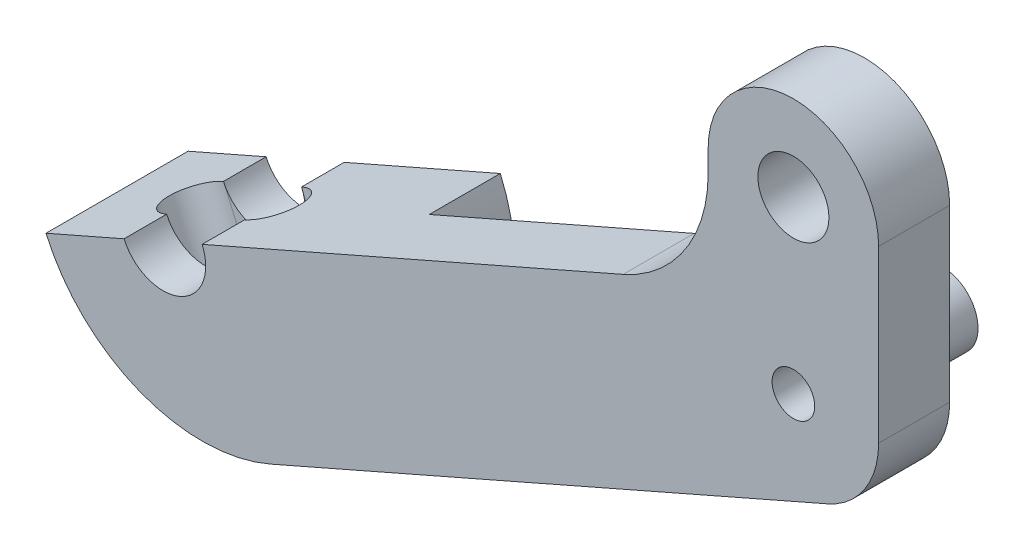
ISO-10303-21;
HEADER;
FILE_DESCRIPTION(('STEP AP214'),'2;1');
FILE_NAME('part.step','',(''),(''),'','','');
FILE_SCHEMA(('AUTOMOTIVE_DESIGN { 1 0 10303 214 1 1 1 1 }'));
ENDSEC;
DATA;
#1=APPLICATION_CONTEXT('core data for automotive mechanical design processes');
#2=APPLICATION_PROTOCOL_DEFINITION('international standard','automotive_design',2000,#1);
#3=PRODUCT_CONTEXT('',#1,'mechanical');
#4=PRODUCT('Part','Part','',(#3));
#5=PRODUCT_RELATED_PRODUCT_CATEGORY('part','',(#4));
#6=PRODUCT_DEFINITION_FORMATION('','',#4);
#7=PRODUCT_DEFINITION_CONTEXT('part definition',#1,'design');
#8=PRODUCT_DEFINITION('design','',#6,#7);
#9=PRODUCT_DEFINITION_SHAPE('','',#8);
#10=(LENGTH_UNIT() NAMED_UNIT(*) SI_UNIT(.MILLI.,.METRE.));
#11=(NAMED_UNIT(*) PLANE_ANGLE_UNIT() SI_UNIT($,.RADIAN.));
#12=(NAMED_UNIT(*) SI_UNIT($,.STERADIAN.) SOLID_ANGLE_UNIT());
#13=UNCERTAINTY_MEASURE_WITH_UNIT(LENGTH_MEASURE(1.E-05),#10,'distance_accuracy_value','');
#14=(GEOMETRIC_REPRESENTATION_CONTEXT(3) GLOBAL_UNCERTAINTY_ASSIGNED_CONTEXT((#13)) GLOBAL_UNIT_ASSIGNED_CONTEXT((#10,
#11,#12)) REPRESENTATION_CONTEXT('',''));
#15=CARTESIAN_POINT('',(0.,0.,0.));
#16=DIRECTION('',(0.,0.,1.));
#17=DIRECTION('',(1.,0.,0.));
#18=AXIS2_PLACEMENT_3D('',#15,#16,#17);
#19=CARTESIAN_POINT('',(0.,-12.,0.));
#20=DIRECTION('',(0.,0.,1.));
#21=DIRECTION('',(1.,0.,0.));
#22=AXIS2_PLACEMENT_3D('',#19,#20,#21);
#23=PLANE('',#22);
#24=DIRECTION('',(0.915917622148678,0.40136630331595,0.));
#25=VECTOR('',#24,1.);
#26=CARTESIAN_POINT('',(2.4081978198957,-17.4955057328921,0.));
#27=LINE('',#26,#25);
#28=CARTESIAN_POINT('',(-34.9786849430438,-33.8788949855906,0.));
#29=VERTEX_POINT('',#28);
#30=CARTESIAN_POINT('',(2.4081978198957,-17.4955057328921,0.));
#31=VERTEX_POINT('',#30);
#32=EDGE_CURVE('E283',#29,#31,#27,.T.);
#33=ORIENTED_EDGE('',*,*,#32,.F.);
#34=DIRECTION('',(0.40136630331595,-0.915917622148678,0.));
#35=VECTOR('',#34,1.);
#36=CARTESIAN_POINT('',(-41.400545796099,-19.2242130312118,0.));
#37=LINE('',#36,#35);
#38=CARTESIAN_POINT('',(-35.0460504375054,-33.7251669745634,0.));
#39=VERTEX_POINT('',#38);
#40=EDGE_CURVE('E55',#29,#39,#37,.F.);
#41=ORIENTED_EDGE('',*,*,#40,.T.);
#42=CARTESIAN_POINT('',(-41.6269158271326,-23.6906161264383,0.));
#43=DIRECTION('',(0.,0.,-1.));
#44=DIRECTION('',(-1.,0.,0.));
#45=AXIS2_PLACEMENT_3D('',#42,#43,#44);
#46=CIRCLE('',#45,12.);
#47=CARTESIAN_POINT('',(-30.6359043613484,-18.8742204866469,0.));
#48=VERTEX_POINT('',#47);
#49=EDGE_CURVE('E248',#48,#39,#46,.T.);
#50=ORIENTED_EDGE('',*,*,#49,.F.);
#51=DIRECTION('',(-0.915917622148678,-0.40136630331595,0.));
#52=VECTOR('',#51,1.);
#53=CARTESIAN_POINT('',(-41.6269158271326,-23.6906161264383,0.));
#54=LINE('',#53,#52);
#55=CARTESIAN_POINT('',(-11.9863369668405,-10.7017519779449,0.));
#56=VERTEX_POINT('',#55);
#57=EDGE_CURVE('E310',#56,#48,#54,.T.);
#58=ORIENTED_EDGE('',*,*,#57,.F.);
#59=CARTESIAN_POINT('',(-16.,-1.54257575645812,0.));
#60=DIRECTION('',(0.,0.,-1.));
#61=DIRECTION('',(-1.,0.,0.));
#62=AXIS2_PLACEMENT_3D('',#59,#60,#61);
#63=CIRCLE('',#62,10.);
#64=CARTESIAN_POINT('',(-5.99999999999999,-1.54257575645804,0.));
#65=VERTEX_POINT('',#64);
#66=EDGE_CURVE('E308',#65,#56,#63,.T.);
#67=ORIENTED_EDGE('',*,*,#66,.F.);
#68=DIRECTION('',(0.,-1.,0.));
#69=VECTOR('',#68,1.);
#70=CARTESIAN_POINT('',(-6.,-1.54257575645804,0.));
#71=LINE('',#70,#69);
#72=CARTESIAN_POINT('',(-6.,0.,0.));
#73=VERTEX_POINT('',#72);
#74=EDGE_CURVE('E306',#73,#65,#71,.T.);
#75=ORIENTED_EDGE('',*,*,#74,.F.);
#76=CARTESIAN_POINT('',(0.,0.,0.));
#77=DIRECTION('',(0.,0.,1.));
#78=DIRECTION('',(1.,0.,0.));
#79=AXIS2_PLACEMENT_3D('',#76,#77,#78);
#80=CIRCLE('',#79,6.);
#81=CARTESIAN_POINT('',(6.,0.,0.));
#82=VERTEX_POINT('',#81);
#83=EDGE_CURVE('E304',#82,#73,#80,.T.);
#84=ORIENTED_EDGE('',*,*,#83,.F.);
#85=DIRECTION('',(0.,1.,0.));
#86=VECTOR('',#85,1.);
#87=CARTESIAN_POINT('',(6.,0.,0.));
#88=LINE('',#87,#86);
#89=CARTESIAN_POINT('',(5.99999999999999,-12.,0.));
#90=VERTEX_POINT('',#89);
#91=EDGE_CURVE('E302',#90,#82,#88,.T.);
#92=ORIENTED_EDGE('',*,*,#91,.F.);
#93=CARTESIAN_POINT('',(0.,-12.,0.));
#94=DIRECTION('',(0.,0.,1.));
#95=DIRECTION('',(1.,0.,0.));
#96=AXIS2_PLACEMENT_3D('',#93,#94,#95);
#97=CIRCLE('',#96,5.99999999999999);
#98=EDGE_CURVE('E276',#31,#90,#97,.T.);
#99=ORIENTED_EDGE('',*,*,#98,.F.);
#100=EDGE_LOOP('',(#33,#41,#50,#58,#67,#75,#84,#92,#99));
#101=FACE_BOUND('',#100,.T.);
#102=CARTESIAN_POINT('',(0.,0.,0.));
#103=DIRECTION('',(0.,0.,1.));
#104=DIRECTION('',(1.,0.,0.));
#105=AXIS2_PLACEMENT_3D('',#102,#103,#104);
#106=CIRCLE('',#105,2.5);
#107=CARTESIAN_POINT('',(2.5,0.,0.));
#108=VERTEX_POINT('',#107);
#109=EDGE_CURVE('E272',#108,#108,#106,.T.);
#110=ORIENTED_EDGE('',*,*,#109,.T.);
#111=EDGE_LOOP('',(#110));
#112=FACE_BOUND('',#111,.T.);
#113=CARTESIAN_POINT('',(0.,-12.,0.));
#114=DIRECTION('',(0.,0.,1.));
#115=DIRECTION('',(1.,0.,0.));
#116=AXIS2_PLACEMENT_3D('',#113,#114,#115);
#117=CIRCLE('',#116,3.5);
#118=CARTESIAN_POINT('',(3.5,-12.,0.));
#119=VERTEX_POINT('',#118);
#120=EDGE_CURVE('E11',#119,#119,#117,.F.);
#121=ORIENTED_EDGE('',*,*,#120,.F.);
#122=EDGE_LOOP('',(#121));
#123=FACE_BOUND('',#122,.T.);
#124=ADVANCED_FACE('F32',(#101,#112,#123),#23,.F.);
#125=CARTESIAN_POINT('',(-44.3746686935786,-24.8947150363862,5.));
#126=DIRECTION('',(0.,0.,-1.));
#127=DIRECTION('',(-1.,0.,0.));
#128=AXIS2_PLACEMENT_3D('',#125,#126,#127);
#129=CYLINDRICAL_SURFACE('',#128,3.);
#130=DIRECTION('',(0.,0.,-1.));
#131=VECTOR('',#130,1.);
#132=CARTESIAN_POINT('',(-47.1224215600246,-26.098813946334,5.));
#133=LINE('',#132,#131);
#134=CARTESIAN_POINT('',(-47.1224215600246,-26.098813946334,-2.));
#135=VERTEX_POINT('',#134);
#136=CARTESIAN_POINT('',(-47.1224215600246,-26.098813946334,-5.));
#137=VERTEX_POINT('',#136);
#138=EDGE_CURVE('E178',#135,#137,#133,.T.);
#139=ORIENTED_EDGE('',*,*,#138,.F.);
#140=CARTESIAN_POINT('',(-44.3746686935786,-24.8947150363862,-2.));
#141=DIRECTION('',(0.,0.,-1.));
#142=DIRECTION('',(-1.,0.,0.));
#143=AXIS2_PLACEMENT_3D('',#140,#141,#142);
#144=CIRCLE('',#143,3.);
#145=CARTESIAN_POINT('',(-41.6269158271326,-23.6906161264384,-2.));
#146=VERTEX_POINT('',#145);
#147=EDGE_CURVE('E245',#135,#146,#144,.F.);
#148=ORIENTED_EDGE('',*,*,#147,.T.);
#149=DIRECTION('',(0.,0.,-1.));
#150=VECTOR('',#149,1.);
#151=CARTESIAN_POINT('',(-41.6269158271326,-23.6906161264383,5.));
#152=LINE('',#151,#150);
#153=CARTESIAN_POINT('',(-41.6269158271326,-23.6906161264383,-5.));
#154=VERTEX_POINT('',#153);
#155=EDGE_CURVE('E187',#146,#154,#152,.T.);
#156=ORIENTED_EDGE('',*,*,#155,.T.);
#157=CARTESIAN_POINT('',(-44.3746686935786,-24.8947150363862,-5.));
#158=DIRECTION('',(0.,0.,1.));
#159=DIRECTION('',(-1.,0.,0.));
#160=AXIS2_PLACEMENT_3D('',#157,#158,#159);
#161=CIRCLE('',#160,3.);
#162=EDGE_CURVE('E249',#137,#154,#161,.T.);
#163=ORIENTED_EDGE('',*,*,#162,.F.);
#164=EDGE_LOOP('',(#139,#148,#156,#163));
#165=FACE_BOUND('',#164,.T.);
#166=ADVANCED_FACE('F339',(#165),#129,.F.);
#167=CARTESIAN_POINT('',(0.,-12.,5.));
#168=DIRECTION('',(0.,0.,1.));
#169=DIRECTION('',(1.,0.,0.));
#170=AXIS2_PLACEMENT_3D('',#167,#168,#169);
#171=PLANE('',#170);
#172=CARTESIAN_POINT('',(0.,-12.,5.));
#173=DIRECTION('',(0.,0.,1.));
#174=DIRECTION('',(1.,0.,0.));
#175=AXIS2_PLACEMENT_3D('',#172,#173,#174);
#176=CIRCLE('',#175,1.5);
#177=CARTESIAN_POINT('',(1.5,-12.,5.));
#178=VERTEX_POINT('',#177);
#179=EDGE_CURVE('E266',#178,#178,#176,.T.);
#180=ORIENTED_EDGE('',*,*,#179,.F.);
#181=EDGE_LOOP('',(#180));
#182=FACE_BOUND('',#181,.T.);
#183=CARTESIAN_POINT('',(0.,-12.,5.));
#184=DIRECTION('',(0.,0.,1.));
#185=DIRECTION('',(1.,0.,0.));
#186=AXIS2_PLACEMENT_3D('',#183,#184,#185);
#187=CIRCLE('',#186,5.99999999999999);
#188=CARTESIAN_POINT('',(2.4081978198957,-17.4955057328921,5.));
#189=VERTEX_POINT('',#188);
#190=CARTESIAN_POINT('',(5.99999999999999,-12.,5.));
#191=VERTEX_POINT('',#190);
#192=EDGE_CURVE('E279',#189,#191,#187,.T.);
#193=ORIENTED_EDGE('',*,*,#192,.T.);
#194=DIRECTION('',(0.,1.,0.));
#195=VECTOR('',#194,1.);
#196=CARTESIAN_POINT('',(6.,0.,5.));
#197=LINE('',#196,#195);
#198=CARTESIAN_POINT('',(6.,0.,5.));
#199=VERTEX_POINT('',#198);
#200=EDGE_CURVE('E282',#191,#199,#197,.T.);
#201=ORIENTED_EDGE('',*,*,#200,.T.);
#202=CARTESIAN_POINT('',(0.,0.,5.));
#203=DIRECTION('',(0.,0.,1.));
#204=DIRECTION('',(1.,0.,0.));
#205=AXIS2_PLACEMENT_3D('',#202,#203,#204);
#206=CIRCLE('',#205,6.);
#207=CARTESIAN_POINT('',(-6.,0.,5.));
#208=VERTEX_POINT('',#207);
#209=EDGE_CURVE('E285',#199,#208,#206,.T.);
#210=ORIENTED_EDGE('',*,*,#209,.T.);
#211=DIRECTION('',(0.,-1.,0.));
#212=VECTOR('',#211,1.);
#213=CARTESIAN_POINT('',(-6.,-1.54257575645804,5.));
#214=LINE('',#213,#212);
#215=CARTESIAN_POINT('',(-5.99999999999999,-1.54257575645804,5.));
#216=VERTEX_POINT('',#215);
#217=EDGE_CURVE('E287',#208,#216,#214,.T.);
#218=ORIENTED_EDGE('',*,*,#217,.T.);
#219=CARTESIAN_POINT('',(-16.,-1.54257575645812,5.));
#220=DIRECTION('',(0.,0.,-1.));
#221=DIRECTION('',(-1.,0.,0.));
#222=AXIS2_PLACEMENT_3D('',#219,#220,#221);
#223=CIRCLE('',#222,10.);
#224=CARTESIAN_POINT('',(-11.9863369668405,-10.7017519779449,5.));
#225=VERTEX_POINT('',#224);
#226=EDGE_CURVE('E289',#216,#225,#223,.T.);
#227=ORIENTED_EDGE('',*,*,#226,.T.);
#228=DIRECTION('',(-0.915917622148678,-0.40136630331595,0.));
#229=VECTOR('',#228,1.);
#230=CARTESIAN_POINT('',(-41.6269158271326,-23.6906161264383,5.));
#231=LINE('',#230,#229);
#232=CARTESIAN_POINT('',(-41.6269158271326,-23.6906161264383,5.));
#233=VERTEX_POINT('',#232);
#234=EDGE_CURVE('E291',#225,#233,#231,.T.);
#235=ORIENTED_EDGE('',*,*,#234,.T.);
#236=CARTESIAN_POINT('',(-44.3746686935786,-24.8947150363862,5.));
#237=DIRECTION('',(0.,0.,-1.));
#238=DIRECTION('',(1.,0.,0.));
#239=AXIS2_PLACEMENT_3D('',#236,#237,#238);
#240=CIRCLE('',#239,3.);
#241=CARTESIAN_POINT('',(-47.1224215600246,-26.098813946334,5.));
#242=VERTEX_POINT('',#241);
#243=EDGE_CURVE('E293',#233,#242,#240,.T.);
#244=ORIENTED_EDGE('',*,*,#243,.T.);
#245=DIRECTION('',(-0.915917622148678,-0.401366303315951,0.));
#246=VECTOR('',#245,1.);
#247=CARTESIAN_POINT('',(-52.6179272929167,-28.5070117662298,5.));
#248=LINE('',#247,#246);
#249=CARTESIAN_POINT('',(-52.6179272929167,-28.5070117662298,5.));
#250=VERTEX_POINT('',#249);
#251=EDGE_CURVE('E295',#242,#250,#248,.T.);
#252=ORIENTED_EDGE('',*,*,#251,.T.);
#253=CARTESIAN_POINT('',(-41.6269158271326,-23.6906161264383,5.));
#254=DIRECTION('',(0.,0.,1.));
#255=DIRECTION('',(1.,0.,0.));
#256=AXIS2_PLACEMENT_3D('',#253,#254,#255);
#257=CIRCLE('',#256,12.);
#258=CARTESIAN_POINT('',(-36.8105201873412,-34.6816275922225,5.));
#259=VERTEX_POINT('',#258);
#260=EDGE_CURVE('E297',#250,#259,#257,.T.);
#261=ORIENTED_EDGE('',*,*,#260,.T.);
#262=DIRECTION('',(0.915917622148678,0.40136630331595,0.));
#263=VECTOR('',#262,1.);
#264=CARTESIAN_POINT('',(2.4081978198957,-17.4955057328921,5.));
#265=LINE('',#264,#263);
#266=EDGE_CURVE('E174',#259,#189,#265,.T.);
#267=ORIENTED_EDGE('',*,*,#266,.T.);
#268=EDGE_LOOP('',(#193,#201,#210,#218,#227,#235,#244,#252,#261,#267));
#269=FACE_BOUND('',#268,.T.);
#270=CARTESIAN_POINT('',(0.,0.,5.));
#271=DIRECTION('',(0.,0.,1.));
#272=DIRECTION('',(1.,0.,0.));
#273=AXIS2_PLACEMENT_3D('',#270,#271,#272);
#274=CIRCLE('',#273,2.5);
#275=CARTESIAN_POINT('',(2.5,0.,5.));
#276=VERTEX_POINT('',#275);
#277=EDGE_CURVE('E273',#276,#276,#274,.T.);
#278=ORIENTED_EDGE('',*,*,#277,.F.);
#279=EDGE_LOOP('',(#278));
#280=FACE_BOUND('',#279,.T.);
#281=ADVANCED_FACE('F325',(#182,#269,#280),#171,.T.);
#282=CARTESIAN_POINT('',(0.,-12.,5.));
#283=DIRECTION('',(0.,0.,-1.));
#284=DIRECTION('',(-1.,0.,0.));
#285=AXIS2_PLACEMENT_3D('',#282,#283,#284);
#286=CYLINDRICAL_SURFACE('',#285,5.99999999999999);
#287=ORIENTED_EDGE('',*,*,#98,.T.);
#288=DIRECTION('',(0.,0.,-1.));
#289=VECTOR('',#288,1.);
#290=CARTESIAN_POINT('',(5.99999999999999,-12.,5.));
#291=LINE('',#290,#289);
#292=EDGE_CURVE('E160',#191,#90,#291,.T.);
#293=ORIENTED_EDGE('',*,*,#292,.F.);
#294=ORIENTED_EDGE('',*,*,#192,.F.);
#295=DIRECTION('',(0.,0.,-1.));
#296=VECTOR('',#295,1.);
#297=CARTESIAN_POINT('',(2.4081978198957,-17.4955057328921,5.));
#298=LINE('',#297,#296);
#299=EDGE_CURVE('E176',#189,#31,#298,.T.);
#300=ORIENTED_EDGE('',*,*,#299,.T.);
#301=EDGE_LOOP('',(#287,#293,#294,#300));
#302=FACE_BOUND('',#301,.T.);
#303=ADVANCED_FACE('F34',(#302),#286,.T.);
#304=CARTESIAN_POINT('',(6.,0.,5.));
#305=DIRECTION('',(-1.,0.,0.));
#306=DIRECTION('',(0.,-1.,0.));
#307=AXIS2_PLACEMENT_3D('',#304,#305,#306);
#308=PLANE('',#307);
#309=ORIENTED_EDGE('',*,*,#91,.T.);
#310=DIRECTION('',(0.,0.,-1.));
#311=VECTOR('',#310,1.);
#312=CARTESIAN_POINT('',(6.,0.,5.));
#313=LINE('',#312,#311);
#314=EDGE_CURVE('E200',#199,#82,#313,.T.);
#315=ORIENTED_EDGE('',*,*,#314,.F.);
#316=ORIENTED_EDGE('',*,*,#200,.F.);
#317=ORIENTED_EDGE('',*,*,#292,.T.);
#318=EDGE_LOOP('',(#309,#315,#316,#317));
#319=FACE_BOUND('',#318,.T.);
#320=ADVANCED_FACE('F322',(#319),#308,.F.);
#321=CARTESIAN_POINT('',(0.,0.,5.));
#322=DIRECTION('',(0.,0.,-1.));
#323=DIRECTION('',(-1.,0.,0.));
#324=AXIS2_PLACEMENT_3D('',#321,#322,#323);
#325=CYLINDRICAL_SURFACE('',#324,6.);
#326=ORIENTED_EDGE('',*,*,#83,.T.);
#327=DIRECTION('',(0.,0.,-1.));
#328=VECTOR('',#327,1.);
#329=CARTESIAN_POINT('',(-6.,0.,5.));
#330=LINE('',#329,#328);
#331=EDGE_CURVE('E197',#208,#73,#330,.T.);
#332=ORIENTED_EDGE('',*,*,#331,.F.);
#333=ORIENTED_EDGE('',*,*,#209,.F.);
#334=ORIENTED_EDGE('',*,*,#314,.T.);
#335=EDGE_LOOP('',(#326,#332,#333,#334));
#336=FACE_BOUND('',#335,.T.);
#337=ADVANCED_FACE('F360',(#336),#325,.T.);
#338=CARTESIAN_POINT('',(-6.,-1.54257575645804,5.));
#339=DIRECTION('',(1.,0.,0.));
#340=DIRECTION('',(0.,1.,0.));
#341=AXIS2_PLACEMENT_3D('',#338,#339,#340);
#342=PLANE('',#341);
#343=ORIENTED_EDGE('',*,*,#74,.T.);
#344=DIRECTION('',(0.,0.,-1.));
#345=VECTOR('',#344,1.);
#346=CARTESIAN_POINT('',(-5.99999999999999,-1.54257575645804,5.));
#347=LINE('',#346,#345);
#348=EDGE_CURVE('E194',#216,#65,#347,.T.);
#349=ORIENTED_EDGE('',*,*,#348,.F.);
#350=ORIENTED_EDGE('',*,*,#217,.F.);
#351=ORIENTED_EDGE('',*,*,#331,.T.);
#352=EDGE_LOOP('',(#343,#349,#350,#351));
#353=FACE_BOUND('',#352,.T.);
#354=ADVANCED_FACE('F358',(#353),#342,.F.);
#355=CARTESIAN_POINT('',(-16.,-1.54257575645812,5.));
#356=DIRECTION('',(0.,0.,-1.));
#357=DIRECTION('',(-1.,0.,0.));
#358=AXIS2_PLACEMENT_3D('',#355,#356,#357);
#359=CYLINDRICAL_SURFACE('',#358,10.);
#360=ORIENTED_EDGE('',*,*,#66,.T.);
#361=DIRECTION('',(0.,0.,-1.));
#362=VECTOR('',#361,1.);
#363=CARTESIAN_POINT('',(-11.9863369668405,-10.7017519779449,5.));
#364=LINE('',#363,#362);
#365=EDGE_CURVE('E191',#225,#56,#364,.T.);
#366=ORIENTED_EDGE('',*,*,#365,.F.);
#367=ORIENTED_EDGE('',*,*,#226,.F.);
#368=ORIENTED_EDGE('',*,*,#348,.T.);
#369=EDGE_LOOP('',(#360,#366,#367,#368));
#370=FACE_BOUND('',#369,.T.);
#371=ADVANCED_FACE('F348',(#370),#359,.F.);
#372=CARTESIAN_POINT('',(-41.6269158271326,-23.6906161264383,5.));
#373=DIRECTION('',(0.40136630331595,-0.915917622148678,0.));
#374=DIRECTION('',(0.915917622148678,0.40136630331595,0.));
#375=AXIS2_PLACEMENT_3D('',#372,#373,#374);
#376=PLANE('',#375);
#377=ORIENTED_EDGE('',*,*,#155,.F.);
#378=CARTESIAN_POINT('',(-41.6269158271326,-23.6906161264384,0.));
#379=DIRECTION('',(0.40136630331595,-0.915917622148678,0.));
#380=DIRECTION('',(0.915917622148678,0.40136630331595,0.));
#381=AXIS2_PLACEMENT_3D('',#378,#379,#380);
#382=CIRCLE('',#381,2.);
#383=CARTESIAN_POINT('',(-41.6269158271326,-23.6906161264384,2.));
#384=VERTEX_POINT('',#383);
#385=EDGE_CURVE('E239',#146,#384,#382,.T.);
#386=ORIENTED_EDGE('',*,*,#385,.T.);
#387=EDGE_CURVE('E188',#233,#384,#152,.T.);
#388=ORIENTED_EDGE('',*,*,#387,.F.);
#389=ORIENTED_EDGE('',*,*,#234,.F.);
#390=ORIENTED_EDGE('',*,*,#365,.T.);
#391=ORIENTED_EDGE('',*,*,#57,.T.);
#392=DIRECTION('',(0.,0.,1.));
#393=VECTOR('',#392,1.);
#394=CARTESIAN_POINT('',(-30.6359043613484,-18.8742204866469,-5.));
#395=LINE('',#394,#393);
#396=CARTESIAN_POINT('',(-30.6359043613484,-18.8742204866469,-5.));
#397=VERTEX_POINT('',#396);
#398=EDGE_CURVE('E260',#397,#48,#395,.T.);
#399=ORIENTED_EDGE('',*,*,#398,.F.);
#400=DIRECTION('',(0.915917622148678,0.40136630331595,0.));
#401=VECTOR('',#400,1.);
#402=CARTESIAN_POINT('',(-41.6269158271326,-23.6906161264383,-5.));
#403=LINE('',#402,#401);
#404=EDGE_CURVE('E252',#154,#397,#403,.T.);
#405=ORIENTED_EDGE('',*,*,#404,.F.);
#406=EDGE_LOOP('',(#377,#386,#388,#389,#390,#391,#399,#405));
#407=FACE_BOUND('',#406,.T.);
#408=ADVANCED_FACE('F342',(#407),#376,.F.);
#409=ORIENTED_EDGE('',*,*,#387,.T.);
#410=CARTESIAN_POINT('',(-44.3746686935786,-24.8947150363862,2.));
#411=DIRECTION('',(0.,0.,1.));
#412=DIRECTION('',(1.,0.,0.));
#413=AXIS2_PLACEMENT_3D('',#410,#411,#412);
#414=CIRCLE('',#413,3.);
#415=CARTESIAN_POINT('',(-47.1224215600246,-26.0988139463341,2.));
#416=VERTEX_POINT('',#415);
#417=EDGE_CURVE('E148',#384,#416,#414,.F.);
#418=ORIENTED_EDGE('',*,*,#417,.T.);
#419=EDGE_CURVE('E184',#242,#416,#133,.T.);
#420=ORIENTED_EDGE('',*,*,#419,.F.);
#421=ORIENTED_EDGE('',*,*,#243,.F.);
#422=EDGE_LOOP('',(#409,#418,#420,#421));
#423=FACE_BOUND('',#422,.T.);
#424=ADVANCED_FACE('F374',(#423),#129,.F.);
#425=CARTESIAN_POINT('',(-52.6179272929167,-28.5070117662298,5.));
#426=DIRECTION('',(0.401366303315951,-0.915917622148678,0.));
#427=DIRECTION('',(0.915917622148678,0.401366303315951,0.));
#428=AXIS2_PLACEMENT_3D('',#425,#426,#427);
#429=PLANE('',#428);
#430=ORIENTED_EDGE('',*,*,#419,.T.);
#431=CARTESIAN_POINT('',(-47.1224215600246,-26.0988139463341,0.));
#432=DIRECTION('',(0.401366303315951,-0.915917622148678,0.));
#433=DIRECTION('',(0.915917622148678,0.401366303315951,0.));
#434=AXIS2_PLACEMENT_3D('',#431,#432,#433);
#435=CIRCLE('',#434,2.);
#436=EDGE_CURVE('E242',#416,#135,#435,.T.);
#437=ORIENTED_EDGE('',*,*,#436,.T.);
#438=ORIENTED_EDGE('',*,*,#138,.T.);
#439=DIRECTION('',(0.915917622148678,0.40136630331595,0.));
#440=VECTOR('',#439,1.);
#441=CARTESIAN_POINT('',(-47.1224215600246,-26.098813946334,-5.));
#442=LINE('',#441,#440);
#443=CARTESIAN_POINT('',(-52.6179272929167,-28.5070117662298,-5.));
#444=VERTEX_POINT('',#443);
#445=EDGE_CURVE('E257',#444,#137,#442,.T.);
#446=ORIENTED_EDGE('',*,*,#445,.F.);
#447=DIRECTION('',(0.,0.,-1.));
#448=VECTOR('',#447,1.);
#449=CARTESIAN_POINT('',(-52.6179272929167,-28.5070117662298,5.));
#450=LINE('',#449,#448);
#451=EDGE_CURVE('E175',#250,#444,#450,.T.);
#452=ORIENTED_EDGE('',*,*,#451,.F.);
#453=ORIENTED_EDGE('',*,*,#251,.F.);
#454=EDGE_LOOP('',(#430,#437,#438,#446,#452,#453));
#455=FACE_BOUND('',#454,.T.);
#456=ADVANCED_FACE('F336',(#455),#429,.F.);
#457=CARTESIAN_POINT('',(-41.6269158271326,-23.6906161264383,5.));
#458=DIRECTION('',(0.,0.,-1.));
#459=DIRECTION('',(-1.,0.,0.));
#460=AXIS2_PLACEMENT_3D('',#457,#458,#459);
#461=CYLINDRICAL_SURFACE('',#460,12.);
#462=ORIENTED_EDGE('',*,*,#49,.T.);
#463=CARTESIAN_POINT('',(-36.8105201873412,-34.6816275922225,2.));
#464=CARTESIAN_POINT('',(-36.7593589363196,-34.6592104711178,2.00000007728029));
#465=CARTESIAN_POINT('',(-36.7083809998215,-34.6364426155429,1.99765851952151));
#466=CARTESIAN_POINT('',(-36.6071055264329,-34.5903680484913,1.98832005299379));
#467=CARTESIAN_POINT('',(-36.556807923639,-34.5670613898093,1.98132359848445));
#468=CARTESIAN_POINT('',(-36.4076049902844,-34.4966712479363,1.9534330322424));
#469=CARTESIAN_POINT('',(-36.3101673197153,-34.4490200090563,1.92563743785079));
#470=CARTESIAN_POINT('',(-36.1220383304655,-34.3539864617584,1.85246899212944));
#471=CARTESIAN_POINT('',(-36.0313485752628,-34.3066042180006,1.80709208226901));
#472=CARTESIAN_POINT('',(-35.8589328730924,-34.2139214662117,1.70007782418192));
#473=CARTESIAN_POINT('',(-35.7772069789596,-34.1686209704518,1.63844038011968));
#474=CARTESIAN_POINT('',(-35.6240039708515,-34.0816166074345,1.50003918943172));
#475=CARTESIAN_POINT('',(-35.5526192691559,-34.03994635675,1.42315205731315));
#476=CARTESIAN_POINT('',(-35.4225467535634,-33.962497555803,1.25669021891862));
#477=CARTESIAN_POINT('',(-35.3638609546449,-33.9267199407601,1.16711350286855));
#478=CARTESIAN_POINT('',(-35.2602098143022,-33.8625778816895,0.977140481980921));
#479=CARTESIAN_POINT('',(-35.2153308811571,-33.8342602773633,0.876681154021405));
#480=CARTESIAN_POINT('',(-35.1408377608991,-33.7867913631846,0.668226147293554));
#481=CARTESIAN_POINT('',(-35.1112216693196,-33.7676389097445,0.560231410688519));
#482=CARTESIAN_POINT('',(-35.0681593745644,-33.7396645237674,0.340817086957497));
#483=CARTESIAN_POINT('',(-35.0545671354552,-33.7307493122072,0.229438072838156));
#484=CARTESIAN_POINT('',(-35.0433924080719,-33.723425650693,0.00553846548181603));
#485=CARTESIAN_POINT('',(-35.0458091678061,-33.7250167072273,-0.106982073886341));
#486=CARTESIAN_POINT('',(-35.0664830738253,-33.7385446436387,-0.328742643142663));
#487=CARTESIAN_POINT('',(-35.0845765301386,-33.7503746114294,-0.438004541756144));
#488=CARTESIAN_POINT('',(-35.1359540590197,-33.7836009624996,-0.651377719006809));
#489=CARTESIAN_POINT('',(-35.1692385558503,-33.8049976129618,-0.755488853700907));
#490=CARTESIAN_POINT('',(-35.2504300935218,-33.8563791143695,-0.956184931600372));
#491=CARTESIAN_POINT('',(-35.2984069385197,-33.8864049200629,-1.05273112208771));
#492=CARTESIAN_POINT('',(-35.4078489472962,-33.9535257847727,-1.2351267380779));
#493=CARTESIAN_POINT('',(-35.4693146977096,-33.9906211512362,-1.32097569810166));
#494=CARTESIAN_POINT('',(-35.6052004449053,-34.070655828646,-1.48064976798115));
#495=CARTESIAN_POINT('',(-35.679770154119,-34.1136612675948,-1.55431439856378));
#496=CARTESIAN_POINT('',(-35.8396320058336,-34.2032621473507,-1.68628614280429));
#497=CARTESIAN_POINT('',(-35.924927165688,-34.2498585969706,-1.74458892042261));
#498=CARTESIAN_POINT('',(-36.1042494171409,-34.3447448765664,-1.84419672726242));
#499=CARTESIAN_POINT('',(-36.1982886293958,-34.3930369975614,-1.8854777177902));
#500=CARTESIAN_POINT('',(-36.3924896168271,-34.4893415545842,-1.94962892777017));
#501=CARTESIAN_POINT('',(-36.492642031531,-34.537354300745,-1.972526570668));
#502=CARTESIAN_POINT('',(-36.630092897436,-34.600855836014,-1.99060413339658));
#503=CARTESIAN_POINT('',(-36.6660234762909,-34.6172403965172,-1.99412906497051));
#504=CARTESIAN_POINT('',(-36.7381114553687,-34.6496829465955,-1.99882392771952));
#505=CARTESIAN_POINT('',(-36.7742683695528,-34.6657414413491,-1.99999782937896));
#506=CARTESIAN_POINT('',(-36.8105201873412,-34.6816275922225,-2.));
#507=B_SPLINE_CURVE_WITH_KNOTS('',3,(#463,#464,#465,#466,#467,#468,#469,#470,#471,#472,#473,
#474,#475,#476,#477,#478,#479,#480,#481,#482,#483,#484,#485,#486,#487,#488,#489,#490,#491,#492,
#493,#494,#495,#496,#497,#498,#499,#500,#501,#502,#503,#504,#505,#506),.UNSPECIFIED.,.F.,.F.,(4,
2,2,2,2,2,2,2,2,2,2,2,2,2,2,2,2,2,2,2,2,4),(0.,0.167466793476603,0.334917246689116,
0.669099418981889,1.00335878103102,1.33762011316668,1.67470522507314,2.01184378427363,
2.35105125919961,2.69021639824865,3.02626600059655,3.36229981777622,3.69486661625038,
4.02744270338202,4.36162405769657,4.69581994849794,5.03411693896799,5.37250931516629,
5.71137795619081,6.04974014412253,6.16862730319591,6.2873135124637),.UNSPECIFIED.);
#508=CARTESIAN_POINT('',(-36.8105201873412,-34.6816275922225,-2.));
#509=VERTEX_POINT('',#508);
#510=EDGE_CURVE('E230',#39,#509,#507,.T.);
#511=ORIENTED_EDGE('',*,*,#510,.T.);
#512=CARTESIAN_POINT('',(-41.6269158271326,-23.6906161264383,-2.));
#513=DIRECTION('',(0.,0.,-1.));
#514=DIRECTION('',(-1.,0.,0.));
#515=AXIS2_PLACEMENT_3D('',#512,#513,#514);
#516=CIRCLE('',#515,12.);
#517=CARTESIAN_POINT('',(-42.9513005812887,-35.6173090889892,-2.));
#518=VERTEX_POINT('',#517);
#519=EDGE_CURVE('E159',#509,#518,#516,.T.);
#520=ORIENTED_EDGE('',*,*,#519,.T.);
#521=CARTESIAN_POINT('',(-42.9513005812887,-35.6173090889892,-2.));
#522=CARTESIAN_POINT('',(-43.036055640392,-35.6079080051801,-1.99999637013235));
#523=CARTESIAN_POINT('',(-43.1206802402788,-35.5975862516514,-1.99590970320728));
#524=CARTESIAN_POINT('',(-43.2889349431612,-35.5752628095557,-1.97986188562703));
#525=CARTESIAN_POINT('',(-43.37256531828,-35.5632615927114,-1.96790294263227));
#526=CARTESIAN_POINT('',(-43.5383605459975,-35.5377021523621,-1.93636107787007));
#527=CARTESIAN_POINT('',(-43.6205210461732,-35.5241399800861,-1.91675850727208));
#528=CARTESIAN_POINT('',(-43.7824706403201,-35.495714716299,-1.8701881620852));
#529=CARTESIAN_POINT('',(-43.8622597667605,-35.480851642611,-1.84322048839183));
#530=CARTESIAN_POINT('',(-44.0814543497193,-35.4377762730699,-1.75767754986114));
#531=CARTESIAN_POINT('',(-44.2175887144856,-35.4083815064623,-1.69105844273576));
#532=CARTESIAN_POINT('',(-44.4758607041307,-35.3482771304575,-1.53537115645926));
#533=CARTESIAN_POINT('',(-44.5980201148537,-35.317569673018,-1.44633863125721));
#534=CARTESIAN_POINT('',(-44.7945398104043,-35.2653190421638,-1.27163021147799));
#535=CARTESIAN_POINT('',(-44.8731594161217,-35.2434294527176,-1.19084698992406));
#536=CARTESIAN_POINT('',(-45.0166611695603,-35.2021400104339,-1.01731839226017));
#537=CARTESIAN_POINT('',(-45.0815644753675,-35.1827363414186,-0.924591800365282));
#538=CARTESIAN_POINT('',(-45.1832061766684,-35.1516405683107,-0.74693944008823));
#539=CARTESIAN_POINT('',(-45.2229526069469,-35.1391837673175,-0.663876686275358));
#540=CARTESIAN_POINT('',(-45.2887344142983,-35.1183142529851,-0.491979331107726));
#541=CARTESIAN_POINT('',(-45.3147798135283,-35.1098985839951,-0.403149002258181));
#542=CARTESIAN_POINT('',(-45.3513722277845,-35.0980177616196,-0.221430514468126));
#543=CARTESIAN_POINT('',(-45.3618283051542,-35.0945816589163,-0.12852177563917));
#544=CARTESIAN_POINT('',(-45.3660273607801,-35.093205903149,0.0577062520767785));
#545=CARTESIAN_POINT('',(-45.3597745474512,-35.0952648660603,0.151025431676858));
#546=CARTESIAN_POINT('',(-45.3324709859779,-35.1041619844243,0.326283697920219));
#547=CARTESIAN_POINT('',(-45.3128455874849,-35.1105394643464,0.408475856485101));
#548=CARTESIAN_POINT('',(-45.261614517241,-35.12694792991,0.568627160924098));
#549=CARTESIAN_POINT('',(-45.2300035267136,-35.1369805374888,0.646584409912211));
#550=CARTESIAN_POINT('',(-45.1447790538133,-35.1635055733806,0.820782395443953));
#551=CARTESIAN_POINT('',(-45.0873686890012,-35.1810375259652,0.915006329869383));
#552=CARTESIAN_POINT('',(-44.9582996230992,-35.219120740954,1.09245325153825));
#553=CARTESIAN_POINT('',(-44.8866149707135,-35.2396774845288,1.17565573564962));
#554=CARTESIAN_POINT('',(-44.7110315813332,-35.2879685314126,1.35159478175195));
#555=CARTESIAN_POINT('',(-44.6036761078571,-35.3161330950558,1.44075856968482));
#556=CARTESIAN_POINT('',(-44.3756237428047,-35.3721584747204,1.60006797070474));
#557=CARTESIAN_POINT('',(-44.2549128708658,-35.4000189382574,1.67019338426703));
#558=CARTESIAN_POINT('',(-44.0021001002315,-35.4539246979821,1.79179443721623));
#559=CARTESIAN_POINT('',(-43.8698708998617,-35.4799418058465,1.84301672407519));
#560=CARTESIAN_POINT('',(-43.5986816405341,-35.5283115895455,1.92463550361569));
#561=CARTESIAN_POINT('',(-43.4597343428013,-35.5506708846228,1.9550699386265));
#562=CARTESIAN_POINT('',(-43.258225684241,-35.5793769365504,1.9829533797816));
#563=CARTESIAN_POINT('',(-43.1970659781308,-35.5876096475621,1.98931998176326));
#564=CARTESIAN_POINT('',(-43.0743988740245,-35.6031561977092,1.99783957042602));
#565=CARTESIAN_POINT('',(-43.0128918677201,-35.6104709143683,1.99999661023927));
#566=CARTESIAN_POINT('',(-42.9513005812887,-35.6173090889892,2.));
#567=B_SPLINE_CURVE_WITH_KNOTS('',3,(#521,#522,#523,#524,#525,#526,#527,#528,#529,#530,#531,
#532,#533,#534,#535,#536,#537,#538,#539,#540,#541,#542,#543,#544,#545,#546,#547,#548,#549,#550,
#551,#552,#553,#554,#555,#556,#557,#558,#559,#560,#561,#562,#563,#564,#565,#566),.UNSPECIFIED.,
.F.,.F.,(4,2,2,2,2,2,2,2,2,2,2,2,2,2,2,2,2,2,2,2,2,2,4),(0.,0.255680498651259,0.511289326113027,
0.767559604031972,1.02382637144695,1.48472594998579,1.94489693888568,2.28817092697036,
2.63091146890202,2.90855953585142,3.18600422280981,3.46506108908189,3.74404767681806,
3.99717485040139,4.25041448448039,4.58375856782748,4.9177143117381,5.34260307535483,
5.76794089542101,6.1987884559864,6.62884750989688,6.81483838230513,7.00065008685467),.UNSPECIFIED.);
#568=CARTESIAN_POINT('',(-42.9513005812887,-35.6173090889892,2.));
#569=VERTEX_POINT('',#568);
#570=EDGE_CURVE('E171',#518,#569,#567,.T.);
#571=ORIENTED_EDGE('',*,*,#570,.T.);
#572=CARTESIAN_POINT('',(-41.6269158271326,-23.6906161264383,2.));
#573=DIRECTION('',(0.,0.,1.));
#574=DIRECTION('',(1.,0.,0.));
#575=AXIS2_PLACEMENT_3D('',#572,#573,#574);
#576=CIRCLE('',#575,12.);
#577=CARTESIAN_POINT('',(-36.8105201873412,-34.6816275922225,2.));
#578=VERTEX_POINT('',#577);
#579=EDGE_CURVE('E40',#569,#578,#576,.T.);
#580=ORIENTED_EDGE('',*,*,#579,.T.);
#581=DIRECTION('',(0.,0.,-1.));
#582=VECTOR('',#581,1.);
#583=CARTESIAN_POINT('',(-36.8105201873412,-34.6816275922225,5.));
#584=LINE('',#583,#582);
#585=EDGE_CURVE('E168',#259,#578,#584,.T.);
#586=ORIENTED_EDGE('',*,*,#585,.F.);
#587=ORIENTED_EDGE('',*,*,#260,.F.);
#588=ORIENTED_EDGE('',*,*,#451,.T.);
#589=CARTESIAN_POINT('',(-41.6269158271326,-23.6906161264383,-5.));
#590=DIRECTION('',(0.,0.,-1.));
#591=DIRECTION('',(-1.,0.,0.));
#592=AXIS2_PLACEMENT_3D('',#589,#590,#591);
#593=CIRCLE('',#592,12.);
#594=EDGE_CURVE('E254',#397,#444,#593,.T.);
#595=ORIENTED_EDGE('',*,*,#594,.F.);
#596=ORIENTED_EDGE('',*,*,#398,.T.);
#597=EDGE_LOOP('',(#462,#511,#520,#571,#580,#586,#587,#588,#595,#596));
#598=FACE_BOUND('',#597,.T.);
#599=ADVANCED_FACE('F166',(#598),#461,.T.);
#600=CARTESIAN_POINT('',(2.4081978198957,-17.4955057328921,5.));
#601=DIRECTION('',(-0.40136630331595,0.915917622148678,0.));
#602=DIRECTION('',(-0.915917622148678,-0.40136630331595,0.));
#603=AXIS2_PLACEMENT_3D('',#600,#601,#602);
#604=PLANE('',#603);
#605=ORIENTED_EDGE('',*,*,#585,.T.);
#606=CARTESIAN_POINT('',(-36.8105201873412,-34.6816275922225,0.));
#607=DIRECTION('',(-0.40136630331595,0.915917622148678,0.));
#608=DIRECTION('',(-0.915917622148678,-0.40136630331595,0.));
#609=AXIS2_PLACEMENT_3D('',#606,#607,#608);
#610=CIRCLE('',#609,2.);
#611=EDGE_CURVE('E153',#578,#29,#610,.T.);
#612=ORIENTED_EDGE('',*,*,#611,.T.);
#613=ORIENTED_EDGE('',*,*,#32,.T.);
#614=ORIENTED_EDGE('',*,*,#299,.F.);
#615=ORIENTED_EDGE('',*,*,#266,.F.);
#616=EDGE_LOOP('',(#605,#612,#613,#614,#615));
#617=FACE_BOUND('',#616,.T.);
#618=ADVANCED_FACE('F172',(#617),#604,.F.);
#619=CARTESIAN_POINT('',(0.,0.,5.));
#620=DIRECTION('',(0.,0.,-1.));
#621=DIRECTION('',(-1.,0.,0.));
#622=AXIS2_PLACEMENT_3D('',#619,#620,#621);
#623=CYLINDRICAL_SURFACE('',#622,2.5);
#624=ORIENTED_EDGE('',*,*,#277,.T.);
#625=EDGE_LOOP('',(#624));
#626=FACE_BOUND('',#625,.T.);
#627=ORIENTED_EDGE('',*,*,#109,.F.);
#628=EDGE_LOOP('',(#627));
#629=FACE_BOUND('',#628,.T.);
#630=ADVANCED_FACE('F378',(#626,#629),#623,.F.);
#631=CARTESIAN_POINT('',(0.,-12.,-5.5));
#632=DIRECTION('',(0.,0.,1.));
#633=DIRECTION('',(1.,0.,0.));
#634=AXIS2_PLACEMENT_3D('',#631,#632,#633);
#635=CYLINDRICAL_SURFACE('',#634,2.5);
#636=CARTESIAN_POINT('',(0.,-12.,-0.5));
#637=DIRECTION('',(0.,0.,-1.));
#638=DIRECTION('',(-1.,0.,0.));
#639=AXIS2_PLACEMENT_3D('',#636,#637,#638);
#640=CIRCLE('',#639,2.5);
#641=CARTESIAN_POINT('',(-2.5,-12.,-0.5));
#642=VERTEX_POINT('',#641);
#643=EDGE_CURVE('E498',#642,#642,#640,.T.);
#644=ORIENTED_EDGE('',*,*,#643,.T.);
#645=EDGE_LOOP('',(#644));
#646=FACE_BOUND('',#645,.T.);
#647=CARTESIAN_POINT('',(0.,-12.,-5.5));
#648=DIRECTION('',(0.,0.,-1.));
#649=DIRECTION('',(-1.,0.,0.));
#650=AXIS2_PLACEMENT_3D('',#647,#648,#649);
#651=CIRCLE('',#650,2.5);
#652=CARTESIAN_POINT('',(-2.5,-12.,-5.5));
#653=VERTEX_POINT('',#652);
#654=EDGE_CURVE('E269',#653,#653,#651,.T.);
#655=ORIENTED_EDGE('',*,*,#654,.F.);
#656=EDGE_LOOP('',(#655));
#657=FACE_BOUND('',#656,.T.);
#658=ADVANCED_FACE('F383',(#646,#657),#635,.T.);
#659=CARTESIAN_POINT('',(0.,-12.,-5.5));
#660=DIRECTION('',(0.,0.,-1.));
#661=DIRECTION('',(-1.,0.,0.));
#662=AXIS2_PLACEMENT_3D('',#659,#660,#661);
#663=PLANE('',#662);
#664=CARTESIAN_POINT('',(0.,-12.,-5.5));
#665=DIRECTION('',(0.,0.,-1.));
#666=DIRECTION('',(-1.,0.,0.));
#667=AXIS2_PLACEMENT_3D('',#664,#665,#666);
#668=CIRCLE('',#667,1.5);
#669=CARTESIAN_POINT('',(-1.5,-12.,-5.5));
#670=VERTEX_POINT('',#669);
#671=EDGE_CURVE('E263',#670,#670,#668,.T.);
#672=ORIENTED_EDGE('',*,*,#671,.F.);
#673=EDGE_LOOP('',(#672));
#674=FACE_BOUND('',#673,.T.);
#675=ORIENTED_EDGE('',*,*,#654,.T.);
#676=EDGE_LOOP('',(#675));
#677=FACE_BOUND('',#676,.T.);
#678=ADVANCED_FACE('F470',(#674,#677),#663,.T.);
#679=CARTESIAN_POINT('',(0.,-12.,19.5));
#680=DIRECTION('',(0.,0.,-1.));
#681=DIRECTION('',(-1.,0.,0.));
#682=AXIS2_PLACEMENT_3D('',#679,#680,#681);
#683=CYLINDRICAL_SURFACE('',#682,1.5);
#684=ORIENTED_EDGE('',*,*,#179,.T.);
#685=EDGE_LOOP('',(#684));
#686=FACE_BOUND('',#685,.T.);
#687=ORIENTED_EDGE('',*,*,#671,.T.);
#688=EDGE_LOOP('',(#687));
#689=FACE_BOUND('',#688,.T.);
#690=ADVANCED_FACE('F510',(#686,#689),#683,.F.);
#691=CARTESIAN_POINT('',(-44.3746686935786,-24.8947150363862,-5.));
#692=DIRECTION('',(0.,0.,-1.));
#693=DIRECTION('',(-1.,0.,0.));
#694=AXIS2_PLACEMENT_3D('',#691,#692,#693);
#695=PLANE('',#694);
#696=ORIENTED_EDGE('',*,*,#162,.T.);
#697=ORIENTED_EDGE('',*,*,#404,.T.);
#698=ORIENTED_EDGE('',*,*,#594,.T.);
#699=ORIENTED_EDGE('',*,*,#445,.T.);
#700=EDGE_LOOP('',(#696,#697,#698,#699));
#701=FACE_BOUND('',#700,.T.);
#702=ADVANCED_FACE('F227',(#701),#695,.T.);
#703=CARTESIAN_POINT('',(-43.2323810403964,-20.0269456378437,-2.));
#704=DIRECTION('',(0.,0.,-1.));
#705=DIRECTION('',(-1.,0.,0.));
#706=AXIS2_PLACEMENT_3D('',#703,#704,#705);
#707=PLANE('',#706);
#708=DIRECTION('',(0.40136630331595,-0.915917622148678,0.));
#709=VECTOR('',#708,1.);
#710=CARTESIAN_POINT('',(-48.7278867732884,-22.4351434577394,-2.));
#711=LINE('',#710,#709);
#712=EDGE_CURVE('E47',#135,#518,#711,.T.);
#713=ORIENTED_EDGE('',*,*,#712,.T.);
#714=ORIENTED_EDGE('',*,*,#519,.F.);
#715=DIRECTION('',(0.40136630331595,-0.915917622148678,0.));
#716=VECTOR('',#715,1.);
#717=CARTESIAN_POINT('',(-43.2323810403964,-20.0269456378437,-2.));
#718=LINE('',#717,#716);
#719=EDGE_CURVE('E236',#146,#509,#718,.T.);
#720=ORIENTED_EDGE('',*,*,#719,.F.);
#721=ORIENTED_EDGE('',*,*,#147,.F.);
#722=EDGE_LOOP('',(#713,#714,#720,#721));
#723=FACE_BOUND('',#722,.T.);
#724=ADVANCED_FACE('F219',(#723),#707,.F.);
#725=CARTESIAN_POINT('',(-48.7278867732884,-22.4351434577394,0.));
#726=DIRECTION('',(0.40136630331595,-0.915917622148678,0.));
#727=DIRECTION('',(0.915917622148678,0.40136630331595,0.));
#728=AXIS2_PLACEMENT_3D('',#725,#726,#727);
#729=CYLINDRICAL_SURFACE('',#728,2.);
#730=DIRECTION('',(0.40136630331595,-0.915917622148678,0.));
#731=VECTOR('',#730,1.);
#732=CARTESIAN_POINT('',(-48.7278867732884,-22.4351434577394,2.));
#733=LINE('',#732,#731);
#734=EDGE_CURVE('E150',#416,#569,#733,.T.);
#735=ORIENTED_EDGE('',*,*,#734,.T.);
#736=ORIENTED_EDGE('',*,*,#570,.F.);
#737=ORIENTED_EDGE('',*,*,#712,.F.);
#738=ORIENTED_EDGE('',*,*,#436,.F.);
#739=EDGE_LOOP('',(#735,#736,#737,#738));
#740=FACE_BOUND('',#739,.T.);
#741=ADVANCED_FACE('F214',(#740),#729,.F.);
#742=CARTESIAN_POINT('',(-43.2323810403964,-20.0269456378437,2.));
#743=DIRECTION('',(0.,0.,1.));
#744=DIRECTION('',(1.,0.,0.));
#745=AXIS2_PLACEMENT_3D('',#742,#743,#744);
#746=PLANE('',#745);
#747=DIRECTION('',(0.40136630331595,-0.915917622148678,0.));
#748=VECTOR('',#747,1.);
#749=CARTESIAN_POINT('',(-43.2323810403964,-20.0269456378437,2.));
#750=LINE('',#749,#748);
#751=EDGE_CURVE('E142',#384,#578,#750,.T.);
#752=ORIENTED_EDGE('',*,*,#751,.T.);
#753=ORIENTED_EDGE('',*,*,#579,.F.);
#754=ORIENTED_EDGE('',*,*,#734,.F.);
#755=ORIENTED_EDGE('',*,*,#417,.F.);
#756=EDGE_LOOP('',(#752,#753,#754,#755));
#757=FACE_BOUND('',#756,.T.);
#758=ADVANCED_FACE('F143',(#757),#746,.F.);
#759=CARTESIAN_POINT('',(-43.2323810403964,-20.0269456378437,0.));
#760=DIRECTION('',(0.40136630331595,-0.915917622148678,0.));
#761=DIRECTION('',(0.915917622148678,0.40136630331595,0.));
#762=AXIS2_PLACEMENT_3D('',#759,#760,#761);
#763=CYLINDRICAL_SURFACE('',#762,2.);
#764=ORIENTED_EDGE('',*,*,#719,.T.);
#765=ORIENTED_EDGE('',*,*,#510,.F.);
#766=ORIENTED_EDGE('',*,*,#40,.F.);
#767=ORIENTED_EDGE('',*,*,#611,.F.);
#768=ORIENTED_EDGE('',*,*,#751,.F.);
#769=ORIENTED_EDGE('',*,*,#385,.F.);
#770=EDGE_LOOP('',(#764,#765,#766,#767,#768,#769));
#771=FACE_BOUND('',#770,.T.);
#772=ADVANCED_FACE('F155',(#771),#763,.F.);
#773=CARTESIAN_POINT('',(0.,-12.,-0.5));
#774=DIRECTION('',(0.,0.,-1.));
#775=DIRECTION('',(-1.,0.,0.));
#776=AXIS2_PLACEMENT_3D('',#773,#774,#775);
#777=PLANE('',#776);
#778=CARTESIAN_POINT('',(0.,-12.,-0.5));
#779=DIRECTION('',(0.,0.,-1.));
#780=DIRECTION('',(-1.,0.,0.));
#781=AXIS2_PLACEMENT_3D('',#778,#779,#780);
#782=CIRCLE('',#781,3.5);
#783=CARTESIAN_POINT('',(-3.5,-12.,-0.5));
#784=VERTEX_POINT('',#783);
#785=EDGE_CURVE('E151',#784,#784,#782,.T.);
#786=ORIENTED_EDGE('',*,*,#785,.T.);
#787=EDGE_LOOP('',(#786));
#788=FACE_BOUND('',#787,.T.);
#789=ORIENTED_EDGE('',*,*,#643,.F.);
#790=EDGE_LOOP('',(#789));
#791=FACE_BOUND('',#790,.T.);
#792=ADVANCED_FACE('F226',(#788,#791),#777,.T.);
#793=CARTESIAN_POINT('',(0.,-12.,-0.5));
#794=DIRECTION('',(0.,0.,1.));
#795=DIRECTION('',(1.,0.,0.));
#796=AXIS2_PLACEMENT_3D('',#793,#794,#795);
#797=CYLINDRICAL_SURFACE('',#796,3.5);
#798=ORIENTED_EDGE('',*,*,#785,.F.);
#799=EDGE_LOOP('',(#798));
#800=FACE_BOUND('',#799,.T.);
#801=ORIENTED_EDGE('',*,*,#120,.T.);
#802=EDGE_LOOP('',(#801));
#803=FACE_BOUND('',#802,.T.);
#804=ADVANCED_FACE('F480',(#800,#803),#797,.T.);
#805=CLOSED_SHELL('',(#124,#166,#281,#303,#320,#337,#354,#371,#408,#424,#456,#599,#618,#630,
#658,#678,#690,#702,#724,#741,#758,#772,#792,#804));
#806=MANIFOLD_SOLID_BREP('B2',#805);
#807=ADVANCED_BREP_SHAPE_REPRESENTATION('',(#18,#806),#14);
#808=SHAPE_DEFINITION_REPRESENTATION(#9,#807);
ENDSEC;
END-ISO-10303-21;
